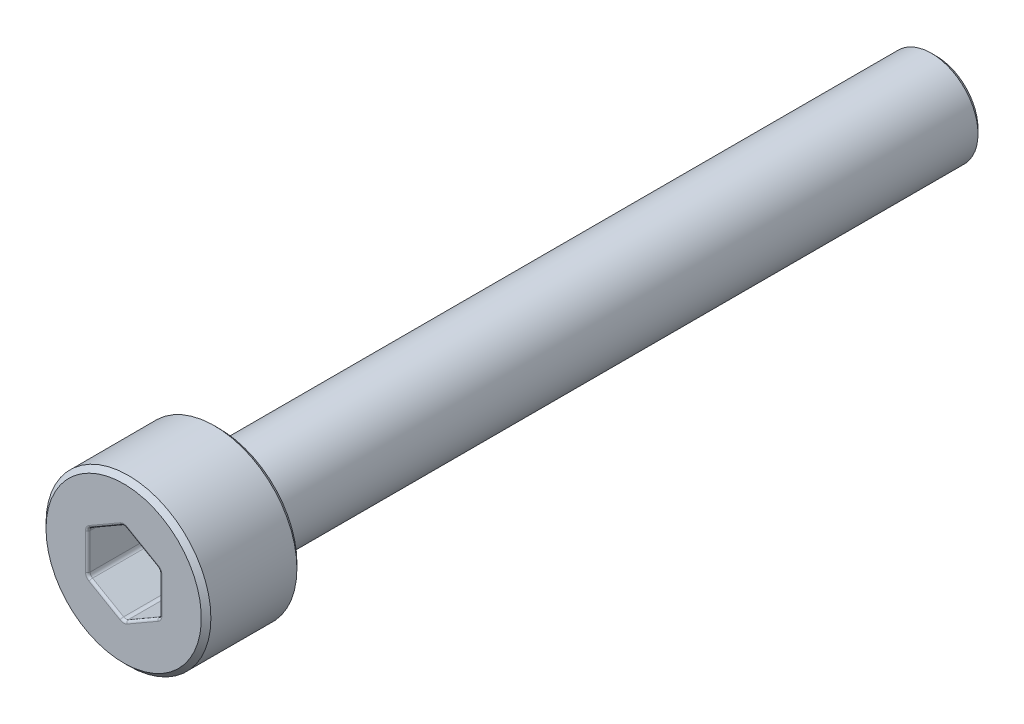
ISO-10303-21;
HEADER;
FILE_DESCRIPTION(('STEP AP214'),'2;1');
FILE_NAME('part.step','',(''),(''),'','','');
FILE_SCHEMA(('AUTOMOTIVE_DESIGN { 1 0 10303 214 1 1 1 1 }'));
ENDSEC;
DATA;
#1=APPLICATION_CONTEXT('core data for automotive mechanical design processes');
#2=APPLICATION_PROTOCOL_DEFINITION('international standard','automotive_design',2000,#1);
#3=PRODUCT_CONTEXT('',#1,'mechanical');
#4=PRODUCT('Part','Part','',(#3));
#5=PRODUCT_RELATED_PRODUCT_CATEGORY('part','',(#4));
#6=PRODUCT_DEFINITION_FORMATION('','',#4);
#7=PRODUCT_DEFINITION_CONTEXT('part definition',#1,'design');
#8=PRODUCT_DEFINITION('design','',#6,#7);
#9=PRODUCT_DEFINITION_SHAPE('','',#8);
#10=(LENGTH_UNIT() NAMED_UNIT(*) SI_UNIT(.MILLI.,.METRE.));
#11=(NAMED_UNIT(*) PLANE_ANGLE_UNIT() SI_UNIT($,.RADIAN.));
#12=(NAMED_UNIT(*) SI_UNIT($,.STERADIAN.) SOLID_ANGLE_UNIT());
#13=UNCERTAINTY_MEASURE_WITH_UNIT(LENGTH_MEASURE(1.E-05),#10,'distance_accuracy_value','');
#14=(GEOMETRIC_REPRESENTATION_CONTEXT(3) GLOBAL_UNCERTAINTY_ASSIGNED_CONTEXT((#13)) GLOBAL_UNIT_ASSIGNED_CONTEXT((#10,
#11,#12)) REPRESENTATION_CONTEXT('',''));
#15=CARTESIAN_POINT('',(0.,0.,0.));
#16=DIRECTION('',(0.,0.,1.));
#17=DIRECTION('',(1.,0.,0.));
#18=AXIS2_PLACEMENT_3D('',#15,#16,#17);
#19=CARTESIAN_POINT('',(0.,0.,4.));
#20=DIRECTION('',(0.,0.,-1.));
#21=DIRECTION('',(-1.,0.,0.));
#22=AXIS2_PLACEMENT_3D('',#19,#20,#21);
#23=PLANE('',#22);
#24=DIRECTION('',(0.,1.,0.));
#25=VECTOR('',#24,1.);
#26=CARTESIAN_POINT('',(1.6,0.,4.));
#27=LINE('',#26,#25);
#28=CARTESIAN_POINT('',(1.6,0.750555349946514,4.));
#29=VERTEX_POINT('',#28);
#30=CARTESIAN_POINT('',(1.6,-0.750555349946514,4.));
#31=VERTEX_POINT('',#30);
#32=EDGE_CURVE('E264',#29,#31,#27,.F.);
#33=ORIENTED_EDGE('',*,*,#32,.T.);
#34=CARTESIAN_POINT('',(1.3,-0.750555349946514,4.));
#35=DIRECTION('',(0.,0.,-1.));
#36=DIRECTION('',(-1.,0.,0.));
#37=AXIS2_PLACEMENT_3D('',#34,#35,#36);
#38=CIRCLE('',#37,0.3);
#39=CARTESIAN_POINT('',(1.45,-1.01036297108185,4.));
#40=VERTEX_POINT('',#39);
#41=EDGE_CURVE('E329',#31,#40,#38,.T.);
#42=ORIENTED_EDGE('',*,*,#41,.T.);
#43=DIRECTION('',(0.866025403784439,0.5,0.));
#44=VECTOR('',#43,1.);
#45=CARTESIAN_POINT('',(0.799999999999999,-1.3856406460551,4.));
#46=LINE('',#45,#44);
#47=CARTESIAN_POINT('',(0.149999999999998,-1.76091832102836,4.));
#48=VERTEX_POINT('',#47);
#49=EDGE_CURVE('E327',#40,#48,#46,.F.);
#50=ORIENTED_EDGE('',*,*,#49,.T.);
#51=CARTESIAN_POINT('',(0.,-1.50111069989303,4.));
#52=DIRECTION('',(0.,0.,-1.));
#53=DIRECTION('',(-1.,0.,0.));
#54=AXIS2_PLACEMENT_3D('',#51,#52,#53);
#55=CIRCLE('',#54,0.3);
#56=CARTESIAN_POINT('',(-0.150000000000001,-1.76091832102836,4.));
#57=VERTEX_POINT('',#56);
#58=EDGE_CURVE('E325',#48,#57,#55,.T.);
#59=ORIENTED_EDGE('',*,*,#58,.T.);
#60=DIRECTION('',(0.866025403784438,-0.5,0.));
#61=VECTOR('',#60,1.);
#62=CARTESIAN_POINT('',(-0.800000000000001,-1.3856406460551,4.));
#63=LINE('',#62,#61);
#64=CARTESIAN_POINT('',(-1.45,-1.01036297108185,4.));
#65=VERTEX_POINT('',#64);
#66=EDGE_CURVE('E323',#57,#65,#63,.F.);
#67=ORIENTED_EDGE('',*,*,#66,.T.);
#68=CARTESIAN_POINT('',(-1.3,-0.750555349946514,4.));
#69=DIRECTION('',(0.,0.,-1.));
#70=DIRECTION('',(-1.,0.,0.));
#71=AXIS2_PLACEMENT_3D('',#68,#69,#70);
#72=CIRCLE('',#71,0.3);
#73=CARTESIAN_POINT('',(-1.6,-0.750555349946514,4.));
#74=VERTEX_POINT('',#73);
#75=EDGE_CURVE('E321',#65,#74,#72,.T.);
#76=ORIENTED_EDGE('',*,*,#75,.T.);
#77=DIRECTION('',(0.,-1.,0.));
#78=VECTOR('',#77,1.);
#79=CARTESIAN_POINT('',(-1.6,0.,4.));
#80=LINE('',#79,#78);
#81=CARTESIAN_POINT('',(-1.6,0.750555349946514,4.));
#82=VERTEX_POINT('',#81);
#83=EDGE_CURVE('E319',#74,#82,#80,.F.);
#84=ORIENTED_EDGE('',*,*,#83,.T.);
#85=CARTESIAN_POINT('',(-1.3,0.750555349946514,4.));
#86=DIRECTION('',(0.,0.,-1.));
#87=DIRECTION('',(-1.,0.,0.));
#88=AXIS2_PLACEMENT_3D('',#85,#86,#87);
#89=CIRCLE('',#88,0.3);
#90=CARTESIAN_POINT('',(-1.45,1.01036297108185,4.));
#91=VERTEX_POINT('',#90);
#92=EDGE_CURVE('E317',#82,#91,#89,.T.);
#93=ORIENTED_EDGE('',*,*,#92,.T.);
#94=DIRECTION('',(-0.866025403784439,-0.5,0.));
#95=VECTOR('',#94,1.);
#96=CARTESIAN_POINT('',(-0.8,1.3856406460551,4.));
#97=LINE('',#96,#95);
#98=CARTESIAN_POINT('',(-0.149999999999999,1.76091832102836,4.));
#99=VERTEX_POINT('',#98);
#100=EDGE_CURVE('E315',#91,#99,#97,.F.);
#101=ORIENTED_EDGE('',*,*,#100,.T.);
#102=CARTESIAN_POINT('',(0.,1.50111069989303,4.));
#103=DIRECTION('',(0.,0.,-1.));
#104=DIRECTION('',(-1.,0.,0.));
#105=AXIS2_PLACEMENT_3D('',#102,#103,#104);
#106=CIRCLE('',#105,0.3);
#107=CARTESIAN_POINT('',(0.150000000000001,1.76091832102836,4.));
#108=VERTEX_POINT('',#107);
#109=EDGE_CURVE('E313',#99,#108,#106,.T.);
#110=ORIENTED_EDGE('',*,*,#109,.T.);
#111=DIRECTION('',(-0.866025403784438,0.5,0.));
#112=VECTOR('',#111,1.);
#113=CARTESIAN_POINT('',(0.800000000000001,1.3856406460551,4.));
#114=LINE('',#113,#112);
#115=CARTESIAN_POINT('',(1.45,1.01036297108185,4.));
#116=VERTEX_POINT('',#115);
#117=EDGE_CURVE('E311',#108,#116,#114,.F.);
#118=ORIENTED_EDGE('',*,*,#117,.T.);
#119=CARTESIAN_POINT('',(1.3,0.750555349946514,4.));
#120=DIRECTION('',(0.,0.,-1.));
#121=DIRECTION('',(-1.,0.,0.));
#122=AXIS2_PLACEMENT_3D('',#119,#120,#121);
#123=CIRCLE('',#122,0.3);
#124=EDGE_CURVE('E309',#116,#29,#123,.T.);
#125=ORIENTED_EDGE('',*,*,#124,.T.);
#126=EDGE_LOOP('',(#33,#42,#50,#59,#67,#76,#84,#93,#101,#110,#118,#125));
#127=FACE_BOUND('',#126,.T.);
#128=CARTESIAN_POINT('',(0.,0.,4.));
#129=DIRECTION('',(0.,0.,-1.));
#130=DIRECTION('',(-1.,0.,0.));
#131=AXIS2_PLACEMENT_3D('',#128,#129,#130);
#132=CIRCLE('',#131,3.25);
#133=CARTESIAN_POINT('',(-3.25,0.,4.));
#134=VERTEX_POINT('',#133);
#135=EDGE_CURVE('E307',#134,#134,#132,.F.);
#136=ORIENTED_EDGE('',*,*,#135,.T.);
#137=EDGE_LOOP('',(#136));
#138=FACE_BOUND('',#137,.T.);
#139=ADVANCED_FACE('F35',(#127,#138),#23,.F.);
#140=CARTESIAN_POINT('',(0.,0.,21.9198795180723));
#141=DIRECTION('',(0.,0.,1.));
#142=DIRECTION('',(1.,0.,0.));
#143=AXIS2_PLACEMENT_3D('',#140,#141,#142);
#144=CYLINDRICAL_SURFACE('',#143,3.45);
#145=CARTESIAN_POINT('',(0.,0.,3.8));
#146=DIRECTION('',(0.,0.,-1.));
#147=DIRECTION('',(-1.,0.,0.));
#148=AXIS2_PLACEMENT_3D('',#145,#146,#147);
#149=CIRCLE('',#148,3.45);
#150=CARTESIAN_POINT('',(-3.45,0.,3.8));
#151=VERTEX_POINT('',#150);
#152=EDGE_CURVE('E869',#151,#151,#149,.T.);
#153=ORIENTED_EDGE('',*,*,#152,.T.);
#154=EDGE_LOOP('',(#153));
#155=FACE_BOUND('',#154,.T.);
#156=CARTESIAN_POINT('',(0.,0.,0.199999999999995));
#157=DIRECTION('',(0.,0.,1.));
#158=DIRECTION('',(1.,0.,0.));
#159=AXIS2_PLACEMENT_3D('',#156,#157,#158);
#160=CIRCLE('',#159,3.45);
#161=CARTESIAN_POINT('',(3.45,0.,0.199999999999995));
#162=VERTEX_POINT('',#161);
#163=EDGE_CURVE('E874',#162,#162,#160,.T.);
#164=ORIENTED_EDGE('',*,*,#163,.T.);
#165=EDGE_LOOP('',(#164));
#166=FACE_BOUND('',#165,.T.);
#167=ADVANCED_FACE('F428',(#155,#166),#144,.T.);
#168=CARTESIAN_POINT('',(0.,3.45,0.));
#169=DIRECTION('',(0.,0.,1.));
#170=DIRECTION('',(1.,0.,0.));
#171=AXIS2_PLACEMENT_3D('',#168,#169,#170);
#172=PLANE('',#171);
#173=CARTESIAN_POINT('',(0.,0.,0.));
#174=DIRECTION('',(0.,0.,1.));
#175=DIRECTION('',(1.,0.,0.));
#176=AXIS2_PLACEMENT_3D('',#173,#174,#175);
#177=CIRCLE('',#176,2.15);
#178=CARTESIAN_POINT('',(2.15,0.,0.));
#179=VERTEX_POINT('',#178);
#180=EDGE_CURVE('E259',#179,#179,#177,.T.);
#181=ORIENTED_EDGE('',*,*,#180,.T.);
#182=EDGE_LOOP('',(#181));
#183=FACE_BOUND('',#182,.T.);
#184=CARTESIAN_POINT('',(0.,0.,0.));
#185=DIRECTION('',(0.,0.,1.));
#186=DIRECTION('',(1.,0.,0.));
#187=AXIS2_PLACEMENT_3D('',#184,#185,#186);
#188=CIRCLE('',#187,3.25);
#189=CARTESIAN_POINT('',(3.25,0.,0.));
#190=VERTEX_POINT('',#189);
#191=EDGE_CURVE('E867',#190,#190,#188,.F.);
#192=ORIENTED_EDGE('',*,*,#191,.T.);
#193=EDGE_LOOP('',(#192));
#194=FACE_BOUND('',#193,.T.);
#195=ADVANCED_FACE('F434',(#183,#194),#172,.F.);
#196=CARTESIAN_POINT('',(0.,0.,21.9198795180723));
#197=DIRECTION('',(0.,0.,1.));
#198=DIRECTION('',(1.,0.,0.));
#199=AXIS2_PLACEMENT_3D('',#196,#197,#198);
#200=CYLINDRICAL_SURFACE('',#199,1.95);
#201=CARTESIAN_POINT('',(0.,0.,-0.200000000000002));
#202=DIRECTION('',(0.,0.,1.));
#203=DIRECTION('',(1.,0.,0.));
#204=AXIS2_PLACEMENT_3D('',#201,#202,#203);
#205=CIRCLE('',#204,1.95);
#206=CARTESIAN_POINT('',(1.95,0.,-0.200000000000002));
#207=VERTEX_POINT('',#206);
#208=EDGE_CURVE('E262',#207,#207,#205,.F.);
#209=ORIENTED_EDGE('',*,*,#208,.T.);
#210=EDGE_LOOP('',(#209));
#211=FACE_BOUND('',#210,.T.);
#212=CARTESIAN_POINT('',(0.,0.,-29.8));
#213=DIRECTION('',(0.,0.,1.));
#214=DIRECTION('',(1.,0.,0.));
#215=AXIS2_PLACEMENT_3D('',#212,#213,#214);
#216=CIRCLE('',#215,1.95);
#217=CARTESIAN_POINT('',(1.95,0.,-29.8));
#218=VERTEX_POINT('',#217);
#219=EDGE_CURVE('E868',#218,#218,#216,.T.);
#220=ORIENTED_EDGE('',*,*,#219,.T.);
#221=EDGE_LOOP('',(#220));
#222=FACE_BOUND('',#221,.T.);
#223=ADVANCED_FACE('F809',(#211,#222),#200,.T.);
#224=CARTESIAN_POINT('',(0.,1.95,-30.));
#225=DIRECTION('',(0.,0.,1.));
#226=DIRECTION('',(1.,0.,0.));
#227=AXIS2_PLACEMENT_3D('',#224,#225,#226);
#228=PLANE('',#227);
#229=CARTESIAN_POINT('',(0.,0.,-30.));
#230=DIRECTION('',(0.,0.,1.));
#231=DIRECTION('',(1.,0.,0.));
#232=AXIS2_PLACEMENT_3D('',#229,#230,#231);
#233=CIRCLE('',#232,1.75);
#234=CARTESIAN_POINT('',(1.75,0.,-30.));
#235=VERTEX_POINT('',#234);
#236=EDGE_CURVE('E209',#235,#235,#233,.F.);
#237=ORIENTED_EDGE('',*,*,#236,.T.);
#238=EDGE_LOOP('',(#237));
#239=FACE_BOUND('',#238,.T.);
#240=ADVANCED_FACE('F801',(#239),#228,.F.);
#241=CARTESIAN_POINT('',(0.,-1.73205080756888,1.5));
#242=DIRECTION('',(0.5,-0.866025403784439,0.));
#243=DIRECTION('',(0.866025403784439,0.5,0.));
#244=AXIS2_PLACEMENT_3D('',#241,#242,#243);
#245=PLANE('',#244);
#246=DIRECTION('',(0.,0.,1.));
#247=VECTOR('',#246,1.);
#248=CARTESIAN_POINT('',(0.0999999999999984,-1.67431578064992,4.));
#249=LINE('',#248,#247);
#250=CARTESIAN_POINT('',(0.0999999999999984,-1.67431578064992,1.7));
#251=VERTEX_POINT('',#250);
#252=CARTESIAN_POINT('',(0.0999999999999984,-1.67431578064992,3.9));
#253=VERTEX_POINT('',#252);
#254=EDGE_CURVE('E256',#251,#253,#249,.T.);
#255=ORIENTED_EDGE('',*,*,#254,.T.);
#256=DIRECTION('',(0.866025403784439,0.5,0.));
#257=VECTOR('',#256,1.);
#258=CARTESIAN_POINT('',(0.,-1.73205080756888,3.9));
#259=LINE('',#258,#257);
#260=CARTESIAN_POINT('',(1.4,-0.923760430703402,3.9));
#261=VERTEX_POINT('',#260);
#262=EDGE_CURVE('E335',#253,#261,#259,.T.);
#263=ORIENTED_EDGE('',*,*,#262,.T.);
#264=DIRECTION('',(0.,0.,1.));
#265=VECTOR('',#264,1.);
#266=CARTESIAN_POINT('',(1.4,-0.923760430703402,1.5));
#267=LINE('',#266,#265);
#268=CARTESIAN_POINT('',(1.4,-0.923760430703402,1.7));
#269=VERTEX_POINT('',#268);
#270=EDGE_CURVE('E252',#261,#269,#267,.F.);
#271=ORIENTED_EDGE('',*,*,#270,.T.);
#272=DIRECTION('',(0.866025403784439,0.5,0.));
#273=VECTOR('',#272,1.);
#274=CARTESIAN_POINT('',(0.,-1.73205080756888,1.7));
#275=LINE('',#274,#273);
#276=EDGE_CURVE('E254',#269,#251,#275,.F.);
#277=ORIENTED_EDGE('',*,*,#276,.T.);
#278=EDGE_LOOP('',(#255,#263,#271,#277));
#279=FACE_BOUND('',#278,.T.);
#280=ADVANCED_FACE('F792',(#279),#245,.F.);
#281=CARTESIAN_POINT('',(-1.5,-0.866025403784439,1.5));
#282=DIRECTION('',(-0.5,-0.866025403784438,0.));
#283=DIRECTION('',(0.866025403784438,-0.5,0.));
#284=AXIS2_PLACEMENT_3D('',#281,#282,#283);
#285=PLANE('',#284);
#286=DIRECTION('',(0.,0.,1.));
#287=VECTOR('',#286,1.);
#288=CARTESIAN_POINT('',(-1.4,-0.923760430703401,4.));
#289=LINE('',#288,#287);
#290=CARTESIAN_POINT('',(-1.4,-0.923760430703401,1.7));
#291=VERTEX_POINT('',#290);
#292=CARTESIAN_POINT('',(-1.4,-0.923760430703401,3.9));
#293=VERTEX_POINT('',#292);
#294=EDGE_CURVE('E223',#291,#293,#289,.T.);
#295=ORIENTED_EDGE('',*,*,#294,.T.);
#296=DIRECTION('',(0.866025403784438,-0.5,0.));
#297=VECTOR('',#296,1.);
#298=CARTESIAN_POINT('',(-1.5,-0.866025403784439,3.9));
#299=LINE('',#298,#297);
#300=CARTESIAN_POINT('',(-0.100000000000001,-1.67431578064992,3.9));
#301=VERTEX_POINT('',#300);
#302=EDGE_CURVE('E339',#293,#301,#299,.T.);
#303=ORIENTED_EDGE('',*,*,#302,.T.);
#304=DIRECTION('',(0.,0.,1.));
#305=VECTOR('',#304,1.);
#306=CARTESIAN_POINT('',(-0.100000000000001,-1.67431578064992,1.5));
#307=LINE('',#306,#305);
#308=CARTESIAN_POINT('',(-0.100000000000001,-1.67431578064992,1.7));
#309=VERTEX_POINT('',#308);
#310=EDGE_CURVE('E215',#301,#309,#307,.F.);
#311=ORIENTED_EDGE('',*,*,#310,.T.);
#312=DIRECTION('',(0.866025403784438,-0.5,0.));
#313=VECTOR('',#312,1.);
#314=CARTESIAN_POINT('',(-1.5,-0.866025403784439,1.7));
#315=LINE('',#314,#313);
#316=EDGE_CURVE('E186',#309,#291,#315,.F.);
#317=ORIENTED_EDGE('',*,*,#316,.T.);
#318=EDGE_LOOP('',(#295,#303,#311,#317));
#319=FACE_BOUND('',#318,.T.);
#320=ADVANCED_FACE('F784',(#319),#285,.F.);
#321=CARTESIAN_POINT('',(-1.5,0.866025403784439,1.5));
#322=DIRECTION('',(-1.,0.,0.));
#323=DIRECTION('',(0.,-1.,0.));
#324=AXIS2_PLACEMENT_3D('',#321,#322,#323);
#325=PLANE('',#324);
#326=DIRECTION('',(0.,0.,1.));
#327=VECTOR('',#326,1.);
#328=CARTESIAN_POINT('',(-1.5,0.750555349946514,4.));
#329=LINE('',#328,#327);
#330=CARTESIAN_POINT('',(-1.5,0.750555349946514,1.7));
#331=VERTEX_POINT('',#330);
#332=CARTESIAN_POINT('',(-1.5,0.750555349946514,3.9));
#333=VERTEX_POINT('',#332);
#334=EDGE_CURVE('E226',#331,#333,#329,.T.);
#335=ORIENTED_EDGE('',*,*,#334,.T.);
#336=DIRECTION('',(0.,-1.,0.));
#337=VECTOR('',#336,1.);
#338=CARTESIAN_POINT('',(-1.5,0.866025403784439,3.9));
#339=LINE('',#338,#337);
#340=CARTESIAN_POINT('',(-1.5,-0.750555349946514,3.9));
#341=VERTEX_POINT('',#340);
#342=EDGE_CURVE('E343',#333,#341,#339,.T.);
#343=ORIENTED_EDGE('',*,*,#342,.T.);
#344=DIRECTION('',(0.,0.,1.));
#345=VECTOR('',#344,1.);
#346=CARTESIAN_POINT('',(-1.5,-0.750555349946514,1.5));
#347=LINE('',#346,#345);
#348=CARTESIAN_POINT('',(-1.5,-0.750555349946514,1.7));
#349=VERTEX_POINT('',#348);
#350=EDGE_CURVE('E231',#341,#349,#347,.F.);
#351=ORIENTED_EDGE('',*,*,#350,.T.);
#352=DIRECTION('',(0.,-1.,0.));
#353=VECTOR('',#352,1.);
#354=CARTESIAN_POINT('',(-1.5,0.866025403784439,1.7));
#355=LINE('',#354,#353);
#356=EDGE_CURVE('E229',#349,#331,#355,.F.);
#357=ORIENTED_EDGE('',*,*,#356,.T.);
#358=EDGE_LOOP('',(#335,#343,#351,#357));
#359=FACE_BOUND('',#358,.T.);
#360=ADVANCED_FACE('F403',(#359),#325,.F.);
#361=CARTESIAN_POINT('',(0.,1.73205080756888,1.5));
#362=DIRECTION('',(-0.5,0.866025403784439,0.));
#363=DIRECTION('',(-0.866025403784439,-0.5,0.));
#364=AXIS2_PLACEMENT_3D('',#361,#362,#363);
#365=PLANE('',#364);
#366=DIRECTION('',(0.,0.,1.));
#367=VECTOR('',#366,1.);
#368=CARTESIAN_POINT('',(-0.0999999999999991,1.67431578064992,4.));
#369=LINE('',#368,#367);
#370=CARTESIAN_POINT('',(-0.0999999999999991,1.67431578064992,1.7));
#371=VERTEX_POINT('',#370);
#372=CARTESIAN_POINT('',(-0.0999999999999991,1.67431578064992,3.9));
#373=VERTEX_POINT('',#372);
#374=EDGE_CURVE('E237',#371,#373,#369,.T.);
#375=ORIENTED_EDGE('',*,*,#374,.T.);
#376=DIRECTION('',(-0.866025403784439,-0.5,0.));
#377=VECTOR('',#376,1.);
#378=CARTESIAN_POINT('',(0.,1.73205080756888,3.9));
#379=LINE('',#378,#377);
#380=CARTESIAN_POINT('',(-1.4,0.923760430703402,3.9));
#381=VERTEX_POINT('',#380);
#382=EDGE_CURVE('E347',#373,#381,#379,.T.);
#383=ORIENTED_EDGE('',*,*,#382,.T.);
#384=DIRECTION('',(0.,0.,1.));
#385=VECTOR('',#384,1.);
#386=CARTESIAN_POINT('',(-1.4,0.923760430703402,1.5));
#387=LINE('',#386,#385);
#388=CARTESIAN_POINT('',(-1.4,0.923760430703402,1.7));
#389=VERTEX_POINT('',#388);
#390=EDGE_CURVE('E233',#381,#389,#387,.F.);
#391=ORIENTED_EDGE('',*,*,#390,.T.);
#392=DIRECTION('',(-0.866025403784439,-0.5,0.));
#393=VECTOR('',#392,1.);
#394=CARTESIAN_POINT('',(0.,1.73205080756888,1.7));
#395=LINE('',#394,#393);
#396=EDGE_CURVE('E235',#389,#371,#395,.F.);
#397=ORIENTED_EDGE('',*,*,#396,.T.);
#398=EDGE_LOOP('',(#375,#383,#391,#397));
#399=FACE_BOUND('',#398,.T.);
#400=ADVANCED_FACE('F767',(#399),#365,.F.);
#401=CARTESIAN_POINT('',(1.5,0.866025403784439,1.5));
#402=DIRECTION('',(0.5,0.866025403784438,0.));
#403=DIRECTION('',(-0.866025403784438,0.5,0.));
#404=AXIS2_PLACEMENT_3D('',#401,#402,#403);
#405=PLANE('',#404);
#406=DIRECTION('',(0.,0.,1.));
#407=VECTOR('',#406,1.);
#408=CARTESIAN_POINT('',(1.4,0.923760430703401,4.));
#409=LINE('',#408,#407);
#410=CARTESIAN_POINT('',(1.4,0.923760430703401,1.7));
#411=VERTEX_POINT('',#410);
#412=CARTESIAN_POINT('',(1.4,0.923760430703401,3.9));
#413=VERTEX_POINT('',#412);
#414=EDGE_CURVE('E244',#411,#413,#409,.T.);
#415=ORIENTED_EDGE('',*,*,#414,.T.);
#416=DIRECTION('',(-0.866025403784438,0.5,0.));
#417=VECTOR('',#416,1.);
#418=CARTESIAN_POINT('',(1.5,0.866025403784439,3.9));
#419=LINE('',#418,#417);
#420=CARTESIAN_POINT('',(0.100000000000001,1.67431578064991,3.9));
#421=VERTEX_POINT('',#420);
#422=EDGE_CURVE('E351',#413,#421,#419,.T.);
#423=ORIENTED_EDGE('',*,*,#422,.T.);
#424=DIRECTION('',(0.,0.,1.));
#425=VECTOR('',#424,1.);
#426=CARTESIAN_POINT('',(0.100000000000001,1.67431578064991,1.5));
#427=LINE('',#426,#425);
#428=CARTESIAN_POINT('',(0.100000000000001,1.67431578064991,1.7));
#429=VERTEX_POINT('',#428);
#430=EDGE_CURVE('E240',#421,#429,#427,.F.);
#431=ORIENTED_EDGE('',*,*,#430,.T.);
#432=DIRECTION('',(-0.866025403784438,0.5,0.));
#433=VECTOR('',#432,1.);
#434=CARTESIAN_POINT('',(1.5,0.866025403784439,1.7));
#435=LINE('',#434,#433);
#436=EDGE_CURVE('E242',#429,#411,#435,.F.);
#437=ORIENTED_EDGE('',*,*,#436,.T.);
#438=EDGE_LOOP('',(#415,#423,#431,#437));
#439=FACE_BOUND('',#438,.T.);
#440=ADVANCED_FACE('F759',(#439),#405,.F.);
#441=CARTESIAN_POINT('',(1.5,-0.86602540378444,1.5));
#442=DIRECTION('',(1.,0.,0.));
#443=DIRECTION('',(0.,1.,0.));
#444=AXIS2_PLACEMENT_3D('',#441,#442,#443);
#445=PLANE('',#444);
#446=DIRECTION('',(0.,0.,1.));
#447=VECTOR('',#446,1.);
#448=CARTESIAN_POINT('',(1.5,-0.750555349946514,4.));
#449=LINE('',#448,#447);
#450=CARTESIAN_POINT('',(1.5,-0.750555349946514,1.7));
#451=VERTEX_POINT('',#450);
#452=CARTESIAN_POINT('',(1.5,-0.750555349946514,3.9));
#453=VERTEX_POINT('',#452);
#454=EDGE_CURVE('E250',#451,#453,#449,.T.);
#455=ORIENTED_EDGE('',*,*,#454,.T.);
#456=DIRECTION('',(0.,1.,0.));
#457=VECTOR('',#456,1.);
#458=CARTESIAN_POINT('',(1.5,-0.86602540378444,3.9));
#459=LINE('',#458,#457);
#460=CARTESIAN_POINT('',(1.5,0.750555349946514,3.9));
#461=VERTEX_POINT('',#460);
#462=EDGE_CURVE('E11',#453,#461,#459,.T.);
#463=ORIENTED_EDGE('',*,*,#462,.T.);
#464=DIRECTION('',(0.,0.,1.));
#465=VECTOR('',#464,1.);
#466=CARTESIAN_POINT('',(1.5,0.750555349946514,1.5));
#467=LINE('',#466,#465);
#468=CARTESIAN_POINT('',(1.5,0.750555349946514,1.7));
#469=VERTEX_POINT('',#468);
#470=EDGE_CURVE('E246',#461,#469,#467,.F.);
#471=ORIENTED_EDGE('',*,*,#470,.T.);
#472=DIRECTION('',(0.,1.,0.));
#473=VECTOR('',#472,1.);
#474=CARTESIAN_POINT('',(1.5,-0.86602540378444,1.7));
#475=LINE('',#474,#473);
#476=EDGE_CURVE('E248',#469,#451,#475,.F.);
#477=ORIENTED_EDGE('',*,*,#476,.T.);
#478=EDGE_LOOP('',(#455,#463,#471,#477));
#479=FACE_BOUND('',#478,.T.);
#480=ADVANCED_FACE('F751',(#479),#445,.F.);
#481=CARTESIAN_POINT('',(0.,0.,1.5));
#482=DIRECTION('',(0.,0.,1.));
#483=DIRECTION('',(1.,0.,0.));
#484=AXIS2_PLACEMENT_3D('',#481,#482,#483);
#485=PLANE('',#484);
#486=DIRECTION('',(0.,-1.,0.));
#487=VECTOR('',#486,1.);
#488=CARTESIAN_POINT('',(-1.3,0.,1.5));
#489=LINE('',#488,#487);
#490=CARTESIAN_POINT('',(-1.3,0.750555349946514,1.5));
#491=VERTEX_POINT('',#490);
#492=CARTESIAN_POINT('',(-1.3,-0.750555349946514,1.5));
#493=VERTEX_POINT('',#492);
#494=EDGE_CURVE('E213',#491,#493,#489,.T.);
#495=ORIENTED_EDGE('',*,*,#494,.T.);
#496=DIRECTION('',(0.866025403784438,-0.5,0.));
#497=VECTOR('',#496,1.);
#498=CARTESIAN_POINT('',(-0.650000000000001,-1.12583302491977,1.5));
#499=LINE('',#498,#497);
#500=CARTESIAN_POINT('',(0.,-1.50111069989303,1.5));
#501=VERTEX_POINT('',#500);
#502=EDGE_CURVE('E184',#493,#501,#499,.T.);
#503=ORIENTED_EDGE('',*,*,#502,.T.);
#504=DIRECTION('',(0.866025403784439,0.5,0.));
#505=VECTOR('',#504,1.);
#506=CARTESIAN_POINT('',(0.65,-1.12583302491977,1.5));
#507=LINE('',#506,#505);
#508=CARTESIAN_POINT('',(1.3,-0.750555349946515,1.5));
#509=VERTEX_POINT('',#508);
#510=EDGE_CURVE('E202',#501,#509,#507,.T.);
#511=ORIENTED_EDGE('',*,*,#510,.T.);
#512=DIRECTION('',(0.,1.,0.));
#513=VECTOR('',#512,1.);
#514=CARTESIAN_POINT('',(1.3,0.,1.5));
#515=LINE('',#514,#513);
#516=CARTESIAN_POINT('',(1.3,0.750555349946514,1.5));
#517=VERTEX_POINT('',#516);
#518=EDGE_CURVE('E208',#509,#517,#515,.T.);
#519=ORIENTED_EDGE('',*,*,#518,.T.);
#520=DIRECTION('',(-0.866025403784438,0.5,0.));
#521=VECTOR('',#520,1.);
#522=CARTESIAN_POINT('',(0.650000000000001,1.12583302491977,1.5));
#523=LINE('',#522,#521);
#524=CARTESIAN_POINT('',(0.,1.50111069989303,1.5));
#525=VERTEX_POINT('',#524);
#526=EDGE_CURVE('E881',#517,#525,#523,.T.);
#527=ORIENTED_EDGE('',*,*,#526,.T.);
#528=DIRECTION('',(-0.866025403784439,-0.5,0.));
#529=VECTOR('',#528,1.);
#530=CARTESIAN_POINT('',(-0.65,1.12583302491977,1.5));
#531=LINE('',#530,#529);
#532=EDGE_CURVE('E218',#525,#491,#531,.T.);
#533=ORIENTED_EDGE('',*,*,#532,.T.);
#534=EDGE_LOOP('',(#495,#503,#511,#519,#527,#533));
#535=FACE_BOUND('',#534,.T.);
#536=ADVANCED_FACE('F211',(#535),#485,.T.);
#537=CARTESIAN_POINT('',(0.,0.,4.));
#538=DIRECTION('',(0.,0.,-1.));
#539=DIRECTION('',(-1.,0.,0.));
#540=AXIS2_PLACEMENT_3D('',#537,#538,#539);
#541=CONICAL_SURFACE('',#540,3.25,0.785398163397453);
#542=ORIENTED_EDGE('',*,*,#152,.F.);
#543=EDGE_LOOP('',(#542));
#544=FACE_BOUND('',#543,.T.);
#545=ORIENTED_EDGE('',*,*,#135,.F.);
#546=EDGE_LOOP('',(#545));
#547=FACE_BOUND('',#546,.T.);
#548=ADVANCED_FACE('F440',(#544,#547),#541,.T.);
#549=CARTESIAN_POINT('',(0.,0.,0.199999999999995));
#550=DIRECTION('',(0.,0.,1.));
#551=DIRECTION('',(1.,0.,0.));
#552=AXIS2_PLACEMENT_3D('',#549,#550,#551);
#553=CONICAL_SURFACE('',#552,3.45,0.785398163397454);
#554=ORIENTED_EDGE('',*,*,#191,.F.);
#555=EDGE_LOOP('',(#554));
#556=FACE_BOUND('',#555,.T.);
#557=ORIENTED_EDGE('',*,*,#163,.F.);
#558=EDGE_LOOP('',(#557));
#559=FACE_BOUND('',#558,.T.);
#560=ADVANCED_FACE('F443',(#556,#559),#553,.T.);
#561=CARTESIAN_POINT('',(0.,0.,-29.8));
#562=DIRECTION('',(0.,0.,1.));
#563=DIRECTION('',(1.,0.,0.));
#564=AXIS2_PLACEMENT_3D('',#561,#562,#563);
#565=CONICAL_SURFACE('',#564,1.95,0.785398163397439);
#566=ORIENTED_EDGE('',*,*,#236,.F.);
#567=EDGE_LOOP('',(#566));
#568=FACE_BOUND('',#567,.T.);
#569=ORIENTED_EDGE('',*,*,#219,.F.);
#570=EDGE_LOOP('',(#569));
#571=FACE_BOUND('',#570,.T.);
#572=ADVANCED_FACE('F447',(#568,#571),#565,.T.);
#573=CARTESIAN_POINT('',(0.,1.50111069989303,1.5));
#574=DIRECTION('',(0.,0.,-1.));
#575=DIRECTION('',(-1.,0.,0.));
#576=AXIS2_PLACEMENT_3D('',#573,#574,#575);
#577=CYLINDRICAL_SURFACE('',#576,0.2);
#578=ORIENTED_EDGE('',*,*,#430,.F.);
#579=CARTESIAN_POINT('',(0.,1.50111069989303,3.9));
#580=DIRECTION('',(0.,0.,-1.));
#581=DIRECTION('',(-1.,0.,0.));
#582=AXIS2_PLACEMENT_3D('',#579,#580,#581);
#583=CIRCLE('',#582,0.2);
#584=EDGE_CURVE('E349',#421,#373,#583,.F.);
#585=ORIENTED_EDGE('',*,*,#584,.T.);
#586=ORIENTED_EDGE('',*,*,#374,.F.);
#587=CARTESIAN_POINT('',(0.,1.50111069989303,1.7));
#588=DIRECTION('',(0.,0.,1.));
#589=DIRECTION('',(1.,0.,0.));
#590=AXIS2_PLACEMENT_3D('',#587,#588,#589);
#591=CIRCLE('',#590,0.2);
#592=EDGE_CURVE('E304',#429,#371,#591,.T.);
#593=ORIENTED_EDGE('',*,*,#592,.F.);
#594=EDGE_LOOP('',(#578,#585,#586,#593));
#595=FACE_BOUND('',#594,.T.);
#596=ADVANCED_FACE('F451',(#595),#577,.F.);
#597=CARTESIAN_POINT('',(0.650000000000001,1.12583302491977,1.7));
#598=DIRECTION('',(-0.866025403784438,0.5,0.));
#599=DIRECTION('',(-0.5,-0.866025403784438,0.));
#600=AXIS2_PLACEMENT_3D('',#597,#598,#599);
#601=CYLINDRICAL_SURFACE('',#600,0.2);
#602=CARTESIAN_POINT('',(1.3,0.750555349946514,1.7));
#603=DIRECTION('',(-0.866025403784438,0.5,0.));
#604=DIRECTION('',(-0.5,-0.866025403784439,0.));
#605=AXIS2_PLACEMENT_3D('',#602,#603,#604);
#606=CIRCLE('',#605,0.2);
#607=EDGE_CURVE('E298',#411,#517,#606,.T.);
#608=ORIENTED_EDGE('',*,*,#607,.F.);
#609=ORIENTED_EDGE('',*,*,#436,.F.);
#610=CARTESIAN_POINT('',(0.,1.50111069989303,1.7));
#611=DIRECTION('',(0.866025403784438,-0.500000000000002,0.));
#612=DIRECTION('',(0.500000000000002,0.866025403784438,0.));
#613=AXIS2_PLACEMENT_3D('',#610,#611,#612);
#614=CIRCLE('',#613,0.2);
#615=EDGE_CURVE('E301',#525,#429,#614,.T.);
#616=ORIENTED_EDGE('',*,*,#615,.F.);
#617=ORIENTED_EDGE('',*,*,#526,.F.);
#618=EDGE_LOOP('',(#608,#609,#616,#617));
#619=FACE_BOUND('',#618,.T.);
#620=ADVANCED_FACE('F712',(#619),#601,.F.);
#621=CARTESIAN_POINT('',(1.3,0.750555349946514,1.5));
#622=DIRECTION('',(0.,0.,-1.));
#623=DIRECTION('',(-1.,0.,0.));
#624=AXIS2_PLACEMENT_3D('',#621,#622,#623);
#625=CYLINDRICAL_SURFACE('',#624,0.2);
#626=ORIENTED_EDGE('',*,*,#470,.F.);
#627=CARTESIAN_POINT('',(1.3,0.750555349946514,3.9));
#628=DIRECTION('',(0.,0.,-1.));
#629=DIRECTION('',(-1.,0.,0.));
#630=AXIS2_PLACEMENT_3D('',#627,#628,#629);
#631=CIRCLE('',#630,0.2);
#632=EDGE_CURVE('E44',#461,#413,#631,.F.);
#633=ORIENTED_EDGE('',*,*,#632,.T.);
#634=ORIENTED_EDGE('',*,*,#414,.F.);
#635=CARTESIAN_POINT('',(1.3,0.750555349946514,1.7));
#636=DIRECTION('',(0.,0.,1.));
#637=DIRECTION('',(1.,0.,0.));
#638=AXIS2_PLACEMENT_3D('',#635,#636,#637);
#639=CIRCLE('',#638,0.2);
#640=EDGE_CURVE('E295',#469,#411,#639,.T.);
#641=ORIENTED_EDGE('',*,*,#640,.F.);
#642=EDGE_LOOP('',(#626,#633,#634,#641));
#643=FACE_BOUND('',#642,.T.);
#644=ADVANCED_FACE('F703',(#643),#625,.F.);
#645=CARTESIAN_POINT('',(0.,1.50111069989303,1.7));
#646=DIRECTION('',(0.,0.,1.));
#647=DIRECTION('',(1.,0.,0.));
#648=AXIS2_PLACEMENT_3D('',#645,#646,#647);
#649=SPHERICAL_SURFACE('',#648,0.2);
#650=ORIENTED_EDGE('',*,*,#615,.T.);
#651=ORIENTED_EDGE('',*,*,#592,.T.);
#652=CARTESIAN_POINT('',(0.,1.50111069989303,1.7));
#653=DIRECTION('',(-0.866025403784439,-0.5,0.));
#654=DIRECTION('',(0.5,-0.866025403784439,0.));
#655=AXIS2_PLACEMENT_3D('',#652,#653,#654);
#656=CIRCLE('',#655,0.2);
#657=EDGE_CURVE('E292',#525,#371,#656,.F.);
#658=ORIENTED_EDGE('',*,*,#657,.F.);
#659=EDGE_LOOP('',(#650,#651,#658));
#660=FACE_BOUND('',#659,.T.);
#661=ADVANCED_FACE('F694',(#660),#649,.F.);
#662=CARTESIAN_POINT('',(1.3,0.750555349946514,1.7));
#663=DIRECTION('',(0.,0.,1.));
#664=DIRECTION('',(1.,0.,0.));
#665=AXIS2_PLACEMENT_3D('',#662,#663,#664);
#666=SPHERICAL_SURFACE('',#665,0.2);
#667=ORIENTED_EDGE('',*,*,#640,.T.);
#668=ORIENTED_EDGE('',*,*,#607,.T.);
#669=CARTESIAN_POINT('',(1.3,0.750555349946514,1.7));
#670=DIRECTION('',(0.,-1.,0.));
#671=DIRECTION('',(1.,0.,0.));
#672=AXIS2_PLACEMENT_3D('',#669,#670,#671);
#673=CIRCLE('',#672,0.2);
#674=EDGE_CURVE('E289',#469,#517,#673,.F.);
#675=ORIENTED_EDGE('',*,*,#674,.F.);
#676=EDGE_LOOP('',(#667,#668,#675));
#677=FACE_BOUND('',#676,.T.);
#678=ADVANCED_FACE('F686',(#677),#666,.F.);
#679=CARTESIAN_POINT('',(-1.3,0.750555349946514,1.5));
#680=DIRECTION('',(0.,0.,-1.));
#681=DIRECTION('',(-1.,0.,0.));
#682=AXIS2_PLACEMENT_3D('',#679,#680,#681);
#683=CYLINDRICAL_SURFACE('',#682,0.2);
#684=ORIENTED_EDGE('',*,*,#390,.F.);
#685=CARTESIAN_POINT('',(-1.3,0.750555349946514,3.9));
#686=DIRECTION('',(0.,0.,-1.));
#687=DIRECTION('',(-1.,0.,0.));
#688=AXIS2_PLACEMENT_3D('',#685,#686,#687);
#689=CIRCLE('',#688,0.2);
#690=EDGE_CURVE('E345',#381,#333,#689,.F.);
#691=ORIENTED_EDGE('',*,*,#690,.T.);
#692=ORIENTED_EDGE('',*,*,#334,.F.);
#693=CARTESIAN_POINT('',(-1.3,0.750555349946514,1.7));
#694=DIRECTION('',(0.,0.,1.));
#695=DIRECTION('',(1.,0.,0.));
#696=AXIS2_PLACEMENT_3D('',#693,#694,#695);
#697=CIRCLE('',#696,0.2);
#698=EDGE_CURVE('E286',#389,#331,#697,.T.);
#699=ORIENTED_EDGE('',*,*,#698,.F.);
#700=EDGE_LOOP('',(#684,#691,#692,#699));
#701=FACE_BOUND('',#700,.T.);
#702=ADVANCED_FACE('F400',(#701),#683,.F.);
#703=CARTESIAN_POINT('',(-0.65,1.12583302491977,1.7));
#704=DIRECTION('',(-0.866025403784439,-0.5,0.));
#705=DIRECTION('',(0.5,-0.866025403784439,0.));
#706=AXIS2_PLACEMENT_3D('',#703,#704,#705);
#707=CYLINDRICAL_SURFACE('',#706,0.2);
#708=ORIENTED_EDGE('',*,*,#657,.T.);
#709=ORIENTED_EDGE('',*,*,#396,.F.);
#710=CARTESIAN_POINT('',(-1.3,0.750555349946514,1.7));
#711=DIRECTION('',(0.866025403784438,0.500000000000001,0.));
#712=DIRECTION('',(-0.500000000000001,0.866025403784438,0.));
#713=AXIS2_PLACEMENT_3D('',#710,#711,#712);
#714=CIRCLE('',#713,0.2);
#715=EDGE_CURVE('E283',#491,#389,#714,.T.);
#716=ORIENTED_EDGE('',*,*,#715,.F.);
#717=ORIENTED_EDGE('',*,*,#532,.F.);
#718=EDGE_LOOP('',(#708,#709,#716,#717));
#719=FACE_BOUND('',#718,.T.);
#720=ADVANCED_FACE('F669',(#719),#707,.F.);
#721=CARTESIAN_POINT('',(1.3,0.,1.7));
#722=DIRECTION('',(0.,1.,0.));
#723=DIRECTION('',(-1.,0.,0.));
#724=AXIS2_PLACEMENT_3D('',#721,#722,#723);
#725=CYLINDRICAL_SURFACE('',#724,0.2);
#726=ORIENTED_EDGE('',*,*,#674,.T.);
#727=ORIENTED_EDGE('',*,*,#518,.F.);
#728=CARTESIAN_POINT('',(1.3,-0.750555349946514,1.7));
#729=DIRECTION('',(0.,1.,0.));
#730=DIRECTION('',(0.,0.,1.));
#731=AXIS2_PLACEMENT_3D('',#728,#729,#730);
#732=CIRCLE('',#731,0.2);
#733=EDGE_CURVE('E280',#451,#509,#732,.T.);
#734=ORIENTED_EDGE('',*,*,#733,.F.);
#735=ORIENTED_EDGE('',*,*,#476,.F.);
#736=EDGE_LOOP('',(#726,#727,#734,#735));
#737=FACE_BOUND('',#736,.T.);
#738=ADVANCED_FACE('F660',(#737),#725,.F.);
#739=CARTESIAN_POINT('',(1.3,-0.750555349946514,1.5));
#740=DIRECTION('',(0.,0.,-1.));
#741=DIRECTION('',(-1.,0.,0.));
#742=AXIS2_PLACEMENT_3D('',#739,#740,#741);
#743=CYLINDRICAL_SURFACE('',#742,0.2);
#744=ORIENTED_EDGE('',*,*,#270,.F.);
#745=CARTESIAN_POINT('',(1.3,-0.750555349946514,3.9));
#746=DIRECTION('',(0.,0.,-1.));
#747=DIRECTION('',(-1.,0.,0.));
#748=AXIS2_PLACEMENT_3D('',#745,#746,#747);
#749=CIRCLE('',#748,0.2);
#750=EDGE_CURVE('E332',#261,#453,#749,.F.);
#751=ORIENTED_EDGE('',*,*,#750,.T.);
#752=ORIENTED_EDGE('',*,*,#454,.F.);
#753=CARTESIAN_POINT('',(1.3,-0.750555349946514,1.7));
#754=DIRECTION('',(0.,0.,1.));
#755=DIRECTION('',(1.,0.,0.));
#756=AXIS2_PLACEMENT_3D('',#753,#754,#755);
#757=CIRCLE('',#756,0.2);
#758=EDGE_CURVE('E277',#269,#451,#757,.T.);
#759=ORIENTED_EDGE('',*,*,#758,.F.);
#760=EDGE_LOOP('',(#744,#751,#752,#759));
#761=FACE_BOUND('',#760,.T.);
#762=ADVANCED_FACE('F651',(#761),#743,.F.);
#763=CARTESIAN_POINT('',(-1.3,0.750555349946514,1.7));
#764=DIRECTION('',(0.,0.,1.));
#765=DIRECTION('',(1.,0.,0.));
#766=AXIS2_PLACEMENT_3D('',#763,#764,#765);
#767=SPHERICAL_SURFACE('',#766,0.2);
#768=ORIENTED_EDGE('',*,*,#715,.T.);
#769=ORIENTED_EDGE('',*,*,#698,.T.);
#770=CARTESIAN_POINT('',(-1.3,0.750555349946514,1.7));
#771=DIRECTION('',(0.,-1.,0.));
#772=DIRECTION('',(0.,0.,-1.));
#773=AXIS2_PLACEMENT_3D('',#770,#771,#772);
#774=CIRCLE('',#773,0.2);
#775=EDGE_CURVE('E274',#491,#331,#774,.F.);
#776=ORIENTED_EDGE('',*,*,#775,.F.);
#777=EDGE_LOOP('',(#768,#769,#776));
#778=FACE_BOUND('',#777,.T.);
#779=ADVANCED_FACE('F642',(#778),#767,.F.);
#780=CARTESIAN_POINT('',(1.3,-0.750555349946514,1.7));
#781=DIRECTION('',(0.,0.,1.));
#782=DIRECTION('',(1.,0.,0.));
#783=AXIS2_PLACEMENT_3D('',#780,#781,#782);
#784=SPHERICAL_SURFACE('',#783,0.2);
#785=ORIENTED_EDGE('',*,*,#758,.T.);
#786=ORIENTED_EDGE('',*,*,#733,.T.);
#787=CARTESIAN_POINT('',(1.3,-0.750555349946515,1.7));
#788=DIRECTION('',(-0.866025403784438,-0.500000000000001,0.));
#789=DIRECTION('',(0.500000000000001,-0.866025403784438,0.));
#790=AXIS2_PLACEMENT_3D('',#787,#788,#789);
#791=CIRCLE('',#790,0.2);
#792=EDGE_CURVE('E205',#269,#509,#791,.F.);
#793=ORIENTED_EDGE('',*,*,#792,.F.);
#794=EDGE_LOOP('',(#785,#786,#793));
#795=FACE_BOUND('',#794,.T.);
#796=ADVANCED_FACE('F634',(#795),#784,.F.);
#797=CARTESIAN_POINT('',(-1.3,-0.750555349946514,1.5));
#798=DIRECTION('',(0.,0.,-1.));
#799=DIRECTION('',(-1.,0.,0.));
#800=AXIS2_PLACEMENT_3D('',#797,#798,#799);
#801=CYLINDRICAL_SURFACE('',#800,0.2);
#802=ORIENTED_EDGE('',*,*,#350,.F.);
#803=CARTESIAN_POINT('',(-1.3,-0.750555349946514,3.9));
#804=DIRECTION('',(0.,0.,-1.));
#805=DIRECTION('',(-1.,0.,0.));
#806=AXIS2_PLACEMENT_3D('',#803,#804,#805);
#807=CIRCLE('',#806,0.2);
#808=EDGE_CURVE('E341',#341,#293,#807,.F.);
#809=ORIENTED_EDGE('',*,*,#808,.T.);
#810=ORIENTED_EDGE('',*,*,#294,.F.);
#811=CARTESIAN_POINT('',(-1.3,-0.750555349946514,1.7));
#812=DIRECTION('',(0.,0.,1.));
#813=DIRECTION('',(1.,0.,0.));
#814=AXIS2_PLACEMENT_3D('',#811,#812,#813);
#815=CIRCLE('',#814,0.2);
#816=EDGE_CURVE('E270',#349,#291,#815,.T.);
#817=ORIENTED_EDGE('',*,*,#816,.F.);
#818=EDGE_LOOP('',(#802,#809,#810,#817));
#819=FACE_BOUND('',#818,.T.);
#820=ADVANCED_FACE('F413',(#819),#801,.F.);
#821=CARTESIAN_POINT('',(-1.3,0.,1.7));
#822=DIRECTION('',(0.,-1.,0.));
#823=DIRECTION('',(1.,0.,0.));
#824=AXIS2_PLACEMENT_3D('',#821,#822,#823);
#825=CYLINDRICAL_SURFACE('',#824,0.2);
#826=ORIENTED_EDGE('',*,*,#775,.T.);
#827=ORIENTED_EDGE('',*,*,#356,.F.);
#828=CARTESIAN_POINT('',(-1.3,-0.750555349946514,1.7));
#829=DIRECTION('',(0.,1.,0.));
#830=DIRECTION('',(-1.,0.,0.));
#831=AXIS2_PLACEMENT_3D('',#828,#829,#830);
#832=CIRCLE('',#831,0.2);
#833=EDGE_CURVE('E199',#493,#349,#832,.T.);
#834=ORIENTED_EDGE('',*,*,#833,.F.);
#835=ORIENTED_EDGE('',*,*,#494,.F.);
#836=EDGE_LOOP('',(#826,#827,#834,#835));
#837=FACE_BOUND('',#836,.T.);
#838=ADVANCED_FACE('F408',(#837),#825,.F.);
#839=CARTESIAN_POINT('',(0.649999999999999,-1.12583302491977,1.7));
#840=DIRECTION('',(0.866025403784439,0.5,0.));
#841=DIRECTION('',(-0.5,0.866025403784439,0.));
#842=AXIS2_PLACEMENT_3D('',#839,#840,#841);
#843=CYLINDRICAL_SURFACE('',#842,0.2);
#844=ORIENTED_EDGE('',*,*,#792,.T.);
#845=ORIENTED_EDGE('',*,*,#510,.F.);
#846=CARTESIAN_POINT('',(0.,-1.50111069989303,1.7));
#847=DIRECTION('',(0.866025403784439,0.5,0.));
#848=DIRECTION('',(-0.5,0.866025403784439,0.));
#849=AXIS2_PLACEMENT_3D('',#846,#847,#848);
#850=CIRCLE('',#849,0.2);
#851=EDGE_CURVE('E192',#251,#501,#850,.T.);
#852=ORIENTED_EDGE('',*,*,#851,.F.);
#853=ORIENTED_EDGE('',*,*,#276,.F.);
#854=EDGE_LOOP('',(#844,#845,#852,#853));
#855=FACE_BOUND('',#854,.T.);
#856=ADVANCED_FACE('F203',(#855),#843,.F.);
#857=CARTESIAN_POINT('',(0.,-1.50111069989303,1.5));
#858=DIRECTION('',(0.,0.,-1.));
#859=DIRECTION('',(-1.,0.,0.));
#860=AXIS2_PLACEMENT_3D('',#857,#858,#859);
#861=CYLINDRICAL_SURFACE('',#860,0.2);
#862=ORIENTED_EDGE('',*,*,#310,.F.);
#863=CARTESIAN_POINT('',(0.,-1.50111069989303,3.9));
#864=DIRECTION('',(0.,0.,-1.));
#865=DIRECTION('',(-1.,0.,0.));
#866=AXIS2_PLACEMENT_3D('',#863,#864,#865);
#867=CIRCLE('',#866,0.2);
#868=EDGE_CURVE('E337',#301,#253,#867,.F.);
#869=ORIENTED_EDGE('',*,*,#868,.T.);
#870=ORIENTED_EDGE('',*,*,#254,.F.);
#871=CARTESIAN_POINT('',(0.,-1.50111069989303,1.7));
#872=DIRECTION('',(0.,0.,1.));
#873=DIRECTION('',(1.,0.,0.));
#874=AXIS2_PLACEMENT_3D('',#871,#872,#873);
#875=CIRCLE('',#874,0.2);
#876=EDGE_CURVE('E196',#309,#251,#875,.T.);
#877=ORIENTED_EDGE('',*,*,#876,.F.);
#878=EDGE_LOOP('',(#862,#869,#870,#877));
#879=FACE_BOUND('',#878,.T.);
#880=ADVANCED_FACE('F418',(#879),#861,.F.);
#881=CARTESIAN_POINT('',(-1.3,-0.750555349946514,1.7));
#882=DIRECTION('',(0.,0.,1.));
#883=DIRECTION('',(1.,0.,0.));
#884=AXIS2_PLACEMENT_3D('',#881,#882,#883);
#885=SPHERICAL_SURFACE('',#884,0.2);
#886=ORIENTED_EDGE('',*,*,#833,.T.);
#887=ORIENTED_EDGE('',*,*,#816,.T.);
#888=CARTESIAN_POINT('',(-1.3,-0.750555349946514,1.7));
#889=DIRECTION('',(0.866025403784438,-0.5,0.));
#890=DIRECTION('',(0.5,0.866025403784439,0.));
#891=AXIS2_PLACEMENT_3D('',#888,#889,#890);
#892=CIRCLE('',#891,0.2);
#893=EDGE_CURVE('E189',#493,#291,#892,.F.);
#894=ORIENTED_EDGE('',*,*,#893,.F.);
#895=EDGE_LOOP('',(#886,#887,#894));
#896=FACE_BOUND('',#895,.T.);
#897=ADVANCED_FACE('F416',(#896),#885,.F.);
#898=CARTESIAN_POINT('',(0.,-1.50111069989303,1.7));
#899=DIRECTION('',(0.,0.,1.));
#900=DIRECTION('',(1.,0.,0.));
#901=AXIS2_PLACEMENT_3D('',#898,#899,#900);
#902=SPHERICAL_SURFACE('',#901,0.2);
#903=ORIENTED_EDGE('',*,*,#876,.T.);
#904=ORIENTED_EDGE('',*,*,#851,.T.);
#905=CARTESIAN_POINT('',(0.,-1.50111069989303,1.7));
#906=DIRECTION('',(-0.866025403784438,0.500000000000001,0.));
#907=DIRECTION('',(-0.500000000000001,-0.866025403784438,0.));
#908=AXIS2_PLACEMENT_3D('',#905,#906,#907);
#909=CIRCLE('',#908,0.2);
#910=EDGE_CURVE('E180',#309,#501,#909,.F.);
#911=ORIENTED_EDGE('',*,*,#910,.F.);
#912=EDGE_LOOP('',(#903,#904,#911));
#913=FACE_BOUND('',#912,.T.);
#914=ADVANCED_FACE('F194',(#913),#902,.F.);
#915=CARTESIAN_POINT('',(-0.650000000000001,-1.12583302491977,1.7));
#916=DIRECTION('',(0.866025403784438,-0.5,0.));
#917=DIRECTION('',(0.5,0.866025403784438,0.));
#918=AXIS2_PLACEMENT_3D('',#915,#916,#917);
#919=CYLINDRICAL_SURFACE('',#918,0.2);
#920=ORIENTED_EDGE('',*,*,#893,.T.);
#921=ORIENTED_EDGE('',*,*,#316,.F.);
#922=ORIENTED_EDGE('',*,*,#910,.T.);
#923=ORIENTED_EDGE('',*,*,#502,.F.);
#924=EDGE_LOOP('',(#920,#921,#922,#923));
#925=FACE_BOUND('',#924,.T.);
#926=ADVANCED_FACE('F182',(#925),#919,.F.);
#927=CARTESIAN_POINT('',(0.,0.,-0.200000000000002));
#928=DIRECTION('',(0.,0.,1.));
#929=DIRECTION('',(1.,0.,0.));
#930=AXIS2_PLACEMENT_3D('',#927,#928,#929);
#931=TOROIDAL_SURFACE('',#930,2.15,0.2);
#932=ORIENTED_EDGE('',*,*,#208,.F.);
#933=EDGE_LOOP('',(#932));
#934=FACE_BOUND('',#933,.T.);
#935=ORIENTED_EDGE('',*,*,#180,.F.);
#936=EDGE_LOOP('',(#935));
#937=FACE_BOUND('',#936,.T.);
#938=ADVANCED_FACE('F454',(#934,#937),#931,.F.);
#939=CARTESIAN_POINT('',(-1.3,0.750555349946514,3.9));
#940=DIRECTION('',(0.,0.,-1.));
#941=DIRECTION('',(-1.,0.,0.));
#942=AXIS2_PLACEMENT_3D('',#939,#940,#941);
#943=TOROIDAL_SURFACE('',#942,0.3,0.1);
#944=CARTESIAN_POINT('',(-1.6,0.750555349946514,3.9));
#945=DIRECTION('',(0.,-1.,0.));
#946=DIRECTION('',(0.,0.,-1.));
#947=AXIS2_PLACEMENT_3D('',#944,#945,#946);
#948=CIRCLE('',#947,0.1);
#949=EDGE_CURVE('E381',#333,#82,#948,.T.);
#950=ORIENTED_EDGE('',*,*,#949,.F.);
#951=ORIENTED_EDGE('',*,*,#690,.F.);
#952=CARTESIAN_POINT('',(-1.45,1.01036297108185,3.9));
#953=DIRECTION('',(0.866025403784439,0.499999999999999,0.));
#954=DIRECTION('',(-0.499999999999999,0.866025403784439,0.));
#955=AXIS2_PLACEMENT_3D('',#952,#953,#954);
#956=CIRCLE('',#955,0.1);
#957=EDGE_CURVE('E39',#91,#381,#956,.T.);
#958=ORIENTED_EDGE('',*,*,#957,.F.);
#959=ORIENTED_EDGE('',*,*,#92,.F.);
#960=EDGE_LOOP('',(#950,#951,#958,#959));
#961=FACE_BOUND('',#960,.T.);
#962=ADVANCED_FACE('F37',(#961),#943,.T.);
#963=CARTESIAN_POINT('',(-0.0499999999999991,1.81865334794732,3.9));
#964=DIRECTION('',(-0.866025403784439,-0.5,0.));
#965=DIRECTION('',(0.5,-0.866025403784439,0.));
#966=AXIS2_PLACEMENT_3D('',#963,#964,#965);
#967=CYLINDRICAL_SURFACE('',#966,0.1);
#968=ORIENTED_EDGE('',*,*,#957,.T.);
#969=ORIENTED_EDGE('',*,*,#382,.F.);
#970=CARTESIAN_POINT('',(-0.149999999999999,1.76091832102836,3.9));
#971=DIRECTION('',(0.866025403784439,0.5,0.));
#972=DIRECTION('',(-0.5,0.866025403784439,0.));
#973=AXIS2_PLACEMENT_3D('',#970,#971,#972);
#974=CIRCLE('',#973,0.1);
#975=EDGE_CURVE('E379',#99,#373,#974,.T.);
#976=ORIENTED_EDGE('',*,*,#975,.F.);
#977=ORIENTED_EDGE('',*,*,#100,.F.);
#978=EDGE_LOOP('',(#968,#969,#976,#977));
#979=FACE_BOUND('',#978,.T.);
#980=ADVANCED_FACE('F392',(#979),#967,.T.);
#981=CARTESIAN_POINT('',(-1.6,0.866025403784439,3.9));
#982=DIRECTION('',(0.,-1.,0.));
#983=DIRECTION('',(1.,0.,0.));
#984=AXIS2_PLACEMENT_3D('',#981,#982,#983);
#985=CYLINDRICAL_SURFACE('',#984,0.1);
#986=ORIENTED_EDGE('',*,*,#949,.T.);
#987=ORIENTED_EDGE('',*,*,#83,.F.);
#988=CARTESIAN_POINT('',(-1.6,-0.750555349946514,3.9));
#989=DIRECTION('',(0.,-1.,0.));
#990=DIRECTION('',(0.,0.,-1.));
#991=AXIS2_PLACEMENT_3D('',#988,#989,#990);
#992=CIRCLE('',#991,0.1);
#993=EDGE_CURVE('E376',#341,#74,#992,.T.);
#994=ORIENTED_EDGE('',*,*,#993,.F.);
#995=ORIENTED_EDGE('',*,*,#342,.F.);
#996=EDGE_LOOP('',(#986,#987,#994,#995));
#997=FACE_BOUND('',#996,.T.);
#998=ADVANCED_FACE('F503',(#997),#985,.T.);
#999=CARTESIAN_POINT('',(0.,1.50111069989303,3.9));
#1000=DIRECTION('',(0.,0.,-1.));
#1001=DIRECTION('',(-1.,0.,0.));
#1002=AXIS2_PLACEMENT_3D('',#999,#1000,#1001);
#1003=TOROIDAL_SURFACE('',#1002,0.3,0.1);
#1004=ORIENTED_EDGE('',*,*,#975,.T.);
#1005=ORIENTED_EDGE('',*,*,#584,.F.);
#1006=CARTESIAN_POINT('',(0.150000000000001,1.76091832102836,3.9));
#1007=DIRECTION('',(0.866025403784438,-0.500000000000001,0.));
#1008=DIRECTION('',(0.500000000000001,0.866025403784438,0.));
#1009=AXIS2_PLACEMENT_3D('',#1006,#1007,#1008);
#1010=CIRCLE('',#1009,0.1);
#1011=EDGE_CURVE('E373',#108,#421,#1010,.T.);
#1012=ORIENTED_EDGE('',*,*,#1011,.F.);
#1013=ORIENTED_EDGE('',*,*,#109,.F.);
#1014=EDGE_LOOP('',(#1004,#1005,#1012,#1013));
#1015=FACE_BOUND('',#1014,.T.);
#1016=ADVANCED_FACE('F499',(#1015),#1003,.T.);
#1017=CARTESIAN_POINT('',(-1.3,-0.750555349946514,3.9));
#1018=DIRECTION('',(0.,0.,-1.));
#1019=DIRECTION('',(-1.,0.,0.));
#1020=AXIS2_PLACEMENT_3D('',#1017,#1018,#1019);
#1021=TOROIDAL_SURFACE('',#1020,0.3,0.1);
#1022=ORIENTED_EDGE('',*,*,#993,.T.);
#1023=ORIENTED_EDGE('',*,*,#75,.F.);
#1024=CARTESIAN_POINT('',(-1.45,-1.01036297108185,3.9));
#1025=DIRECTION('',(0.866025403784438,-0.500000000000001,0.));
#1026=DIRECTION('',(0.500000000000001,0.866025403784438,0.));
#1027=AXIS2_PLACEMENT_3D('',#1024,#1025,#1026);
#1028=CIRCLE('',#1027,0.1);
#1029=EDGE_CURVE('E370',#293,#65,#1028,.T.);
#1030=ORIENTED_EDGE('',*,*,#1029,.F.);
#1031=ORIENTED_EDGE('',*,*,#808,.F.);
#1032=EDGE_LOOP('',(#1022,#1023,#1030,#1031));
#1033=FACE_BOUND('',#1032,.T.);
#1034=ADVANCED_FACE('F495',(#1033),#1021,.T.);
#1035=CARTESIAN_POINT('',(1.55,0.952627944162883,3.9));
#1036=DIRECTION('',(-0.866025403784438,0.5,0.));
#1037=DIRECTION('',(-0.5,-0.866025403784438,0.));
#1038=AXIS2_PLACEMENT_3D('',#1035,#1036,#1037);
#1039=CYLINDRICAL_SURFACE('',#1038,0.1);
#1040=ORIENTED_EDGE('',*,*,#1011,.T.);
#1041=ORIENTED_EDGE('',*,*,#422,.F.);
#1042=CARTESIAN_POINT('',(1.45,1.01036297108185,3.9));
#1043=DIRECTION('',(0.866025403784438,-0.500000000000001,0.));
#1044=DIRECTION('',(0.500000000000001,0.866025403784438,0.));
#1045=AXIS2_PLACEMENT_3D('',#1042,#1043,#1044);
#1046=CIRCLE('',#1045,0.1);
#1047=EDGE_CURVE('E367',#116,#413,#1046,.T.);
#1048=ORIENTED_EDGE('',*,*,#1047,.F.);
#1049=ORIENTED_EDGE('',*,*,#117,.F.);
#1050=EDGE_LOOP('',(#1040,#1041,#1048,#1049));
#1051=FACE_BOUND('',#1050,.T.);
#1052=ADVANCED_FACE('F491',(#1051),#1039,.T.);
#1053=CARTESIAN_POINT('',(-1.55,-0.952627944162882,3.9));
#1054=DIRECTION('',(0.866025403784438,-0.5,0.));
#1055=DIRECTION('',(0.5,0.866025403784438,0.));
#1056=AXIS2_PLACEMENT_3D('',#1053,#1054,#1055);
#1057=CYLINDRICAL_SURFACE('',#1056,0.1);
#1058=ORIENTED_EDGE('',*,*,#1029,.T.);
#1059=ORIENTED_EDGE('',*,*,#66,.F.);
#1060=CARTESIAN_POINT('',(-0.150000000000001,-1.76091832102836,3.9));
#1061=DIRECTION('',(0.866025403784438,-0.5,0.));
#1062=DIRECTION('',(0.5,0.866025403784438,0.));
#1063=AXIS2_PLACEMENT_3D('',#1060,#1061,#1062);
#1064=CIRCLE('',#1063,0.1);
#1065=EDGE_CURVE('E364',#301,#57,#1064,.T.);
#1066=ORIENTED_EDGE('',*,*,#1065,.F.);
#1067=ORIENTED_EDGE('',*,*,#302,.F.);
#1068=EDGE_LOOP('',(#1058,#1059,#1066,#1067));
#1069=FACE_BOUND('',#1068,.T.);
#1070=ADVANCED_FACE('F487',(#1069),#1057,.T.);
#1071=CARTESIAN_POINT('',(1.3,0.750555349946514,3.9));
#1072=DIRECTION('',(0.,0.,-1.));
#1073=DIRECTION('',(-1.,0.,0.));
#1074=AXIS2_PLACEMENT_3D('',#1071,#1072,#1073);
#1075=TOROIDAL_SURFACE('',#1074,0.3,0.1);
#1076=ORIENTED_EDGE('',*,*,#1047,.T.);
#1077=ORIENTED_EDGE('',*,*,#632,.F.);
#1078=CARTESIAN_POINT('',(1.6,0.750555349946514,3.9));
#1079=DIRECTION('',(0.,-1.,0.));
#1080=DIRECTION('',(0.,0.,-1.));
#1081=AXIS2_PLACEMENT_3D('',#1078,#1079,#1080);
#1082=CIRCLE('',#1081,0.1);
#1083=EDGE_CURVE('E361',#29,#461,#1082,.T.);
#1084=ORIENTED_EDGE('',*,*,#1083,.F.);
#1085=ORIENTED_EDGE('',*,*,#124,.F.);
#1086=EDGE_LOOP('',(#1076,#1077,#1084,#1085));
#1087=FACE_BOUND('',#1086,.T.);
#1088=ADVANCED_FACE('F483',(#1087),#1075,.T.);
#1089=CARTESIAN_POINT('',(0.,-1.50111069989303,3.9));
#1090=DIRECTION('',(0.,0.,-1.));
#1091=DIRECTION('',(-1.,0.,0.));
#1092=AXIS2_PLACEMENT_3D('',#1089,#1090,#1091);
#1093=TOROIDAL_SURFACE('',#1092,0.3,0.1);
#1094=ORIENTED_EDGE('',*,*,#1065,.T.);
#1095=ORIENTED_EDGE('',*,*,#58,.F.);
#1096=CARTESIAN_POINT('',(0.149999999999998,-1.76091832102836,3.9));
#1097=DIRECTION('',(0.866025403784439,0.499999999999999,0.));
#1098=DIRECTION('',(-0.499999999999999,0.866025403784439,0.));
#1099=AXIS2_PLACEMENT_3D('',#1096,#1097,#1098);
#1100=CIRCLE('',#1099,0.1);
#1101=EDGE_CURVE('E358',#253,#48,#1100,.T.);
#1102=ORIENTED_EDGE('',*,*,#1101,.F.);
#1103=ORIENTED_EDGE('',*,*,#868,.F.);
#1104=EDGE_LOOP('',(#1094,#1095,#1102,#1103));
#1105=FACE_BOUND('',#1104,.T.);
#1106=ADVANCED_FACE('F479',(#1105),#1093,.T.);
#1107=CARTESIAN_POINT('',(1.6,-0.86602540378444,3.9));
#1108=DIRECTION('',(0.,1.,0.));
#1109=DIRECTION('',(-1.,0.,0.));
#1110=AXIS2_PLACEMENT_3D('',#1107,#1108,#1109);
#1111=CYLINDRICAL_SURFACE('',#1110,0.1);
#1112=ORIENTED_EDGE('',*,*,#1083,.T.);
#1113=ORIENTED_EDGE('',*,*,#462,.F.);
#1114=CARTESIAN_POINT('',(1.6,-0.750555349946514,3.9));
#1115=DIRECTION('',(0.,-1.,0.));
#1116=DIRECTION('',(0.,0.,-1.));
#1117=AXIS2_PLACEMENT_3D('',#1114,#1115,#1116);
#1118=CIRCLE('',#1117,0.1);
#1119=EDGE_CURVE('E356',#31,#453,#1118,.T.);
#1120=ORIENTED_EDGE('',*,*,#1119,.F.);
#1121=ORIENTED_EDGE('',*,*,#32,.F.);
#1122=EDGE_LOOP('',(#1112,#1113,#1120,#1121));
#1123=FACE_BOUND('',#1122,.T.);
#1124=ADVANCED_FACE('F475',(#1123),#1111,.T.);
#1125=CARTESIAN_POINT('',(0.0499999999999984,-1.81865334794732,3.9));
#1126=DIRECTION('',(0.866025403784439,0.5,0.));
#1127=DIRECTION('',(-0.5,0.866025403784439,0.));
#1128=AXIS2_PLACEMENT_3D('',#1125,#1126,#1127);
#1129=CYLINDRICAL_SURFACE('',#1128,0.1);
#1130=ORIENTED_EDGE('',*,*,#1101,.T.);
#1131=ORIENTED_EDGE('',*,*,#49,.F.);
#1132=CARTESIAN_POINT('',(1.45,-1.01036297108185,3.9));
#1133=DIRECTION('',(0.866025403784439,0.5,0.));
#1134=DIRECTION('',(-0.5,0.866025403784439,0.));
#1135=AXIS2_PLACEMENT_3D('',#1132,#1133,#1134);
#1136=CIRCLE('',#1135,0.1);
#1137=EDGE_CURVE('E354',#261,#40,#1136,.T.);
#1138=ORIENTED_EDGE('',*,*,#1137,.F.);
#1139=ORIENTED_EDGE('',*,*,#262,.F.);
#1140=EDGE_LOOP('',(#1130,#1131,#1138,#1139));
#1141=FACE_BOUND('',#1140,.T.);
#1142=ADVANCED_FACE('F471',(#1141),#1129,.T.);
#1143=CARTESIAN_POINT('',(1.3,-0.750555349946514,3.9));
#1144=DIRECTION('',(0.,0.,-1.));
#1145=DIRECTION('',(-1.,0.,0.));
#1146=AXIS2_PLACEMENT_3D('',#1143,#1144,#1145);
#1147=TOROIDAL_SURFACE('',#1146,0.3,0.1);
#1148=ORIENTED_EDGE('',*,*,#1119,.T.);
#1149=ORIENTED_EDGE('',*,*,#750,.F.);
#1150=ORIENTED_EDGE('',*,*,#1137,.T.);
#1151=ORIENTED_EDGE('',*,*,#41,.F.);
#1152=EDGE_LOOP('',(#1148,#1149,#1150,#1151));
#1153=FACE_BOUND('',#1152,.T.);
#1154=ADVANCED_FACE('F468',(#1153),#1147,.T.);
#1155=CLOSED_SHELL('',(#139,#167,#195,#223,#240,#280,#320,#360,#400,#440,#480,#536,#548,#560,
#572,#596,#620,#644,#661,#678,#702,#720,#738,#762,#779,#796,#820,#838,#856,#880,#897,#914,#926,
#938,#962,#980,#998,#1016,#1034,#1052,#1070,#1088,#1106,#1124,#1142,#1154));
#1156=MANIFOLD_SOLID_BREP('B2',#1155);
#1157=ADVANCED_BREP_SHAPE_REPRESENTATION('',(#18,#1156),#14);
#1158=SHAPE_DEFINITION_REPRESENTATION(#9,#1157);
ENDSEC;
END-ISO-10303-21;
